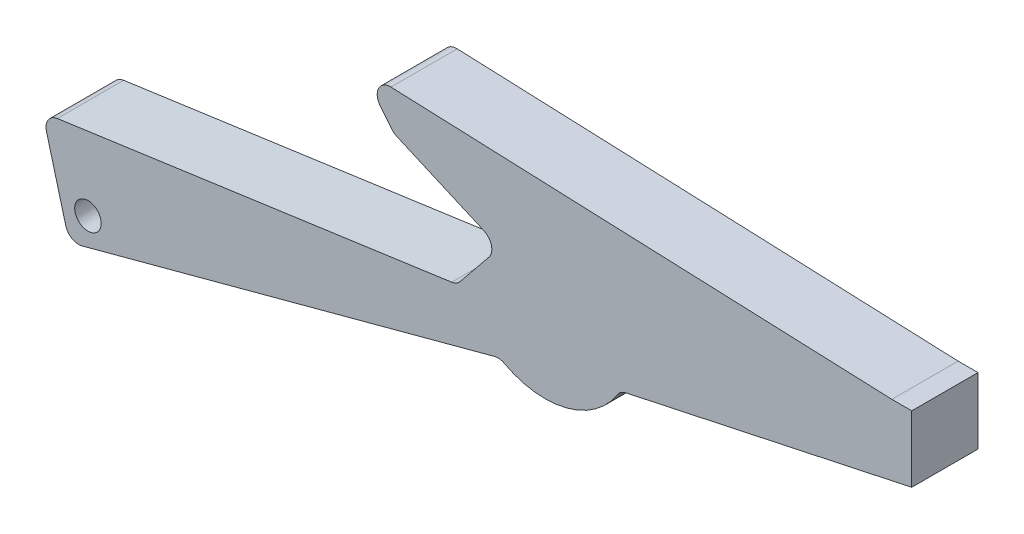
ISO-10303-21;
HEADER;
FILE_DESCRIPTION(('STEP AP214'),'2;1');
FILE_NAME('part.step','',(''),(''),'','','');
FILE_SCHEMA(('AUTOMOTIVE_DESIGN { 1 0 10303 214 1 1 1 1 }'));
ENDSEC;
DATA;
#1=APPLICATION_CONTEXT('core data for automotive mechanical design processes');
#2=APPLICATION_PROTOCOL_DEFINITION('international standard','automotive_design',2000,#1);
#3=PRODUCT_CONTEXT('',#1,'mechanical');
#4=PRODUCT('Part','Part','',(#3));
#5=PRODUCT_RELATED_PRODUCT_CATEGORY('part','',(#4));
#6=PRODUCT_DEFINITION_FORMATION('','',#4);
#7=PRODUCT_DEFINITION_CONTEXT('part definition',#1,'design');
#8=PRODUCT_DEFINITION('design','',#6,#7);
#9=PRODUCT_DEFINITION_SHAPE('','',#8);
#10=(LENGTH_UNIT() NAMED_UNIT(*) SI_UNIT(.MILLI.,.METRE.));
#11=(NAMED_UNIT(*) PLANE_ANGLE_UNIT() SI_UNIT($,.RADIAN.));
#12=(NAMED_UNIT(*) SI_UNIT($,.STERADIAN.) SOLID_ANGLE_UNIT());
#13=UNCERTAINTY_MEASURE_WITH_UNIT(LENGTH_MEASURE(1.E-05),#10,'distance_accuracy_value','');
#14=(GEOMETRIC_REPRESENTATION_CONTEXT(3) GLOBAL_UNCERTAINTY_ASSIGNED_CONTEXT((#13)) GLOBAL_UNIT_ASSIGNED_CONTEXT((#10,
#11,#12)) REPRESENTATION_CONTEXT('',''));
#15=CARTESIAN_POINT('',(0.,0.,0.));
#16=DIRECTION('',(0.,0.,1.));
#17=DIRECTION('',(1.,0.,0.));
#18=AXIS2_PLACEMENT_3D('',#15,#16,#17);
#19=CARTESIAN_POINT('',(8.56241817604146,-40.0432074228875,10.));
#20=DIRECTION('',(0.209102506116275,-0.977893727322092,0.));
#21=DIRECTION('',(0.977893727322092,0.209102506116275,0.));
#22=AXIS2_PLACEMENT_3D('',#19,#20,#21);
#23=PLANE('',#22);
#24=DIRECTION('',(-0.977893727322092,-0.209102506116275,0.));
#25=VECTOR('',#24,1.);
#26=CARTESIAN_POINT('',(8.56241817604146,-40.0432074228875,10.));
#27=LINE('',#26,#25);
#28=CARTESIAN_POINT('',(103.514798876067,-19.7395893390973,10.));
#29=VERTEX_POINT('',#28);
#30=CARTESIAN_POINT('',(60.3602712703458,-28.9672994884722,10.));
#31=VERTEX_POINT('',#30);
#32=EDGE_CURVE('E178',#29,#31,#27,.T.);
#33=ORIENTED_EDGE('',*,*,#32,.T.);
#34=DIRECTION('',(0.,0.,-1.));
#35=VECTOR('',#34,1.);
#36=CARTESIAN_POINT('',(60.3602712703458,-28.9672994884722,10.));
#37=LINE('',#36,#35);
#38=CARTESIAN_POINT('',(60.3602712703458,-28.9672994884722,0.));
#39=VERTEX_POINT('',#38);
#40=EDGE_CURVE('E184',#31,#39,#37,.T.);
#41=ORIENTED_EDGE('',*,*,#40,.T.);
#42=DIRECTION('',(-0.977893727322092,-0.209102506116275,0.));
#43=VECTOR('',#42,1.);
#44=CARTESIAN_POINT('',(8.56241817604146,-40.0432074228875,0.));
#45=LINE('',#44,#43);
#46=CARTESIAN_POINT('',(103.514798876067,-19.7395893390973,0.));
#47=VERTEX_POINT('',#46);
#48=EDGE_CURVE('E181',#47,#39,#45,.T.);
#49=ORIENTED_EDGE('',*,*,#48,.F.);
#50=DIRECTION('',(0.,0.,-1.));
#51=VECTOR('',#50,1.);
#52=CARTESIAN_POINT('',(103.514798876067,-19.7395893390973,10.));
#53=LINE('',#52,#51);
#54=EDGE_CURVE('E174',#29,#47,#53,.T.);
#55=ORIENTED_EDGE('',*,*,#54,.F.);
#56=EDGE_LOOP('',(#33,#41,#49,#55));
#57=FACE_BOUND('',#56,.T.);
#58=ADVANCED_FACE('F42',(#57),#23,.T.);
#59=CARTESIAN_POINT('',(103.514798876067,0.,10.));
#60=DIRECTION('',(-1.,0.,0.));
#61=DIRECTION('',(0.,0.,1.));
#62=AXIS2_PLACEMENT_3D('',#59,#60,#61);
#63=PLANE('',#62);
#64=DIRECTION('',(0.,1.,0.));
#65=VECTOR('',#64,1.);
#66=CARTESIAN_POINT('',(103.514798876067,0.,0.));
#67=LINE('',#66,#65);
#68=CARTESIAN_POINT('',(103.514798876067,-9.73958933909726,0.));
#69=VERTEX_POINT('',#68);
#70=EDGE_CURVE('E233',#47,#69,#67,.T.);
#71=ORIENTED_EDGE('',*,*,#70,.T.);
#72=DIRECTION('',(0.,0.,-1.));
#73=VECTOR('',#72,1.);
#74=CARTESIAN_POINT('',(103.514798876067,-9.73958933909726,10.));
#75=LINE('',#74,#73);
#76=CARTESIAN_POINT('',(103.514798876067,-9.73958933909726,10.));
#77=VERTEX_POINT('',#76);
#78=EDGE_CURVE('E185',#77,#69,#75,.T.);
#79=ORIENTED_EDGE('',*,*,#78,.F.);
#80=DIRECTION('',(0.,1.,0.));
#81=VECTOR('',#80,1.);
#82=CARTESIAN_POINT('',(103.514798876067,0.,10.));
#83=LINE('',#82,#81);
#84=EDGE_CURVE('E188',#29,#77,#83,.T.);
#85=ORIENTED_EDGE('',*,*,#84,.F.);
#86=ORIENTED_EDGE('',*,*,#54,.T.);
#87=EDGE_LOOP('',(#71,#79,#85,#86));
#88=FACE_BOUND('',#87,.T.);
#89=ADVANCED_FACE('F189',(#88),#63,.F.);
#90=CARTESIAN_POINT('',(0.,-9.73958933909726,10.));
#91=DIRECTION('',(0.,-1.,0.));
#92=DIRECTION('',(0.,0.,-1.));
#93=AXIS2_PLACEMENT_3D('',#90,#91,#92);
#94=PLANE('',#93);
#95=DIRECTION('',(-1.,0.,0.));
#96=VECTOR('',#95,1.);
#97=CARTESIAN_POINT('',(0.,-9.73958933909726,0.));
#98=LINE('',#97,#96);
#99=CARTESIAN_POINT('',(100.514798876067,-9.73958933909726,0.));
#100=VERTEX_POINT('',#99);
#101=EDGE_CURVE('E236',#69,#100,#98,.T.);
#102=ORIENTED_EDGE('',*,*,#101,.T.);
#103=DIRECTION('',(0.,0.,-1.));
#104=VECTOR('',#103,1.);
#105=CARTESIAN_POINT('',(100.514798876067,-9.73958933909726,10.));
#106=LINE('',#105,#104);
#107=CARTESIAN_POINT('',(100.514798876067,-9.73958933909726,10.));
#108=VERTEX_POINT('',#107);
#109=EDGE_CURVE('E231',#108,#100,#106,.T.);
#110=ORIENTED_EDGE('',*,*,#109,.F.);
#111=DIRECTION('',(-1.,0.,0.));
#112=VECTOR('',#111,1.);
#113=CARTESIAN_POINT('',(0.,-9.73958933909726,10.));
#114=LINE('',#113,#112);
#115=EDGE_CURVE('E193',#77,#108,#114,.T.);
#116=ORIENTED_EDGE('',*,*,#115,.F.);
#117=ORIENTED_EDGE('',*,*,#78,.T.);
#118=EDGE_LOOP('',(#102,#110,#116,#117));
#119=FACE_BOUND('',#118,.T.);
#120=ADVANCED_FACE('F380',(#119),#94,.F.);
#121=CARTESIAN_POINT('',(-0.22827300747503,-5.71712938643156,10.));
#122=DIRECTION('',(0.0398961171974141,0.99920383297532,0.));
#123=DIRECTION('',(-0.99920383297532,0.0398961171974141,0.));
#124=AXIS2_PLACEMENT_3D('',#121,#122,#123);
#125=PLANE('',#124);
#126=DIRECTION('',(0.99920383297532,-0.0398961171974141,0.));
#127=VECTOR('',#126,1.);
#128=CARTESIAN_POINT('',(-0.22827300747503,-5.71712938643156,0.));
#129=LINE('',#128,#127);
#130=CARTESIAN_POINT('',(24.9081016634015,-6.7207722035345,0.));
#131=VERTEX_POINT('',#130);
#132=EDGE_CURVE('E239',#131,#100,#129,.T.);
#133=ORIENTED_EDGE('',*,*,#132,.F.);
#134=DIRECTION('',(0.,0.,-1.));
#135=VECTOR('',#134,1.);
#136=CARTESIAN_POINT('',(24.9081016634015,-6.7207722035345,10.));
#137=LINE('',#136,#135);
#138=CARTESIAN_POINT('',(24.9081016634015,-6.7207722035345,10.));
#139=VERTEX_POINT('',#138);
#140=EDGE_CURVE('E306',#131,#139,#137,.F.);
#141=ORIENTED_EDGE('',*,*,#140,.T.);
#142=DIRECTION('',(0.99920383297532,-0.0398961171974141,0.));
#143=VECTOR('',#142,1.);
#144=CARTESIAN_POINT('',(-0.22827300747503,-5.71712938643156,10.));
#145=LINE('',#144,#143);
#146=EDGE_CURVE('E210',#139,#108,#145,.T.);
#147=ORIENTED_EDGE('',*,*,#146,.T.);
#148=ORIENTED_EDGE('',*,*,#109,.T.);
#149=EDGE_LOOP('',(#133,#141,#147,#148));
#150=FACE_BOUND('',#149,.T.);
#151=ADVANCED_FACE('F385',(#150),#125,.T.);
#152=CARTESIAN_POINT('',(9.26585284224266,7.448399080149,10.));
#153=DIRECTION('',(-0.779401131701308,-0.626525239637416,0.));
#154=DIRECTION('',(0.626525239637416,-0.779401131701308,0.));
#155=AXIS2_PLACEMENT_3D('',#152,#153,#154);
#156=PLANE('',#155);
#157=DIRECTION('',(-0.626525239637416,0.779401131701308,0.));
#158=VECTOR('',#157,1.);
#159=CARTESIAN_POINT('',(9.26585284224266,7.448399080149,0.));
#160=LINE('',#159,#158);
#161=CARTESIAN_POINT('',(25.0300767576539,-12.1623894128651,0.));
#162=VERTEX_POINT('',#161);
#163=CARTESIAN_POINT('',(23.2695071656041,-9.97223034875997,0.));
#164=VERTEX_POINT('',#163);
#165=EDGE_CURVE('E241',#162,#164,#160,.T.);
#166=ORIENTED_EDGE('',*,*,#165,.F.);
#167=DIRECTION('',(0.,0.,-1.));
#168=VECTOR('',#167,1.);
#169=CARTESIAN_POINT('',(25.0300767576539,-12.1623894128651,10.));
#170=LINE('',#169,#168);
#171=CARTESIAN_POINT('',(25.0300767576539,-12.1623894128651,10.));
#172=VERTEX_POINT('',#171);
#173=EDGE_CURVE('E297',#162,#172,#170,.F.);
#174=ORIENTED_EDGE('',*,*,#173,.T.);
#175=DIRECTION('',(-0.626525239637416,0.779401131701308,0.));
#176=VECTOR('',#175,1.);
#177=CARTESIAN_POINT('',(9.26585284224266,7.448399080149,10.));
#178=LINE('',#177,#176);
#179=CARTESIAN_POINT('',(23.2695071656041,-9.97223034875997,10.));
#180=VERTEX_POINT('',#179);
#181=EDGE_CURVE('E212',#172,#180,#178,.T.);
#182=ORIENTED_EDGE('',*,*,#181,.T.);
#183=DIRECTION('',(0.,0.,-1.));
#184=VECTOR('',#183,1.);
#185=CARTESIAN_POINT('',(23.2695071656041,-9.97223034875997,10.));
#186=LINE('',#185,#184);
#187=EDGE_CURVE('E294',#180,#164,#186,.T.);
#188=ORIENTED_EDGE('',*,*,#187,.T.);
#189=EDGE_LOOP('',(#166,#174,#182,#188));
#190=FACE_BOUND('',#189,.T.);
#191=ADVANCED_FACE('F388',(#190),#156,.T.);
#192=CARTESIAN_POINT('',(-0.541372474078678,-1.23917524538091,10.));
#193=DIRECTION('',(-0.400342898082665,-0.916365409623679,0.));
#194=DIRECTION('',(0.916365409623679,-0.400342898082665,0.));
#195=AXIS2_PLACEMENT_3D('',#192,#193,#194);
#196=PLANE('',#195);
#197=DIRECTION('',(-0.916365409623679,0.400342898082665,0.));
#198=VECTOR('',#197,1.);
#199=CARTESIAN_POINT('',(-0.541372474078678,-1.23917524538091,0.));
#200=LINE('',#199,#198);
#201=CARTESIAN_POINT('',(38.9310521874236,-18.4839388706525,0.));
#202=VERTEX_POINT('',#201);
#203=CARTESIAN_POINT('',(25.7881932248912,-12.7420697528376,0.));
#204=VERTEX_POINT('',#203);
#205=EDGE_CURVE('E244',#202,#204,#200,.T.);
#206=ORIENTED_EDGE('',*,*,#205,.F.);
#207=DIRECTION('',(0.,0.,-1.));
#208=VECTOR('',#207,1.);
#209=CARTESIAN_POINT('',(38.9310521874235,-18.4839388706525,10.));
#210=LINE('',#209,#208);
#211=CARTESIAN_POINT('',(38.9310521874236,-18.4839388706525,10.));
#212=VERTEX_POINT('',#211);
#213=EDGE_CURVE('E279',#202,#212,#210,.F.);
#214=ORIENTED_EDGE('',*,*,#213,.T.);
#215=DIRECTION('',(-0.916365409623679,0.400342898082665,0.));
#216=VECTOR('',#215,1.);
#217=CARTESIAN_POINT('',(-0.541372474078678,-1.23917524538091,10.));
#218=LINE('',#217,#216);
#219=CARTESIAN_POINT('',(25.7881932248912,-12.7420697528376,10.));
#220=VERTEX_POINT('',#219);
#221=EDGE_CURVE('E215',#212,#220,#218,.T.);
#222=ORIENTED_EDGE('',*,*,#221,.T.);
#223=DIRECTION('',(0.,0.,-1.));
#224=VECTOR('',#223,1.);
#225=CARTESIAN_POINT('',(25.7881932248912,-12.7420697528376,10.));
#226=LINE('',#225,#224);
#227=EDGE_CURVE('E276',#220,#204,#226,.T.);
#228=ORIENTED_EDGE('',*,*,#227,.T.);
#229=EDGE_LOOP('',(#206,#214,#222,#228));
#230=FACE_BOUND('',#229,.T.);
#231=ADVANCED_FACE('F392',(#230),#196,.T.);
#232=CARTESIAN_POINT('',(34.5051859559979,-27.9659022448351,10.));
#233=DIRECTION('',(-0.776879926305614,0.629648775194063,0.));
#234=DIRECTION('',(-0.629648775194063,-0.776879926305614,0.));
#235=AXIS2_PLACEMENT_3D('',#232,#233,#234);
#236=PLANE('',#235);
#237=DIRECTION('',(0.629648775194063,0.776879926305614,0.));
#238=VECTOR('',#237,1.);
#239=CARTESIAN_POINT('',(34.5051859559979,-27.9659022448351,10.));
#240=LINE('',#239,#238);
#241=CARTESIAN_POINT('',(35.3497977673189,-26.9237943466126,10.));
#242=VERTEX_POINT('',#241);
#243=CARTESIAN_POINT('',(39.6841262438694,-21.5759672402879,10.));
#244=VERTEX_POINT('',#243);
#245=EDGE_CURVE('E218',#242,#244,#240,.T.);
#246=ORIENTED_EDGE('',*,*,#245,.T.);
#247=DIRECTION('',(0.,0.,-1.));
#248=VECTOR('',#247,1.);
#249=CARTESIAN_POINT('',(39.6841262438694,-21.5759672402879,0.));
#250=LINE('',#249,#248);
#251=CARTESIAN_POINT('',(39.6841262438694,-21.5759672402879,0.));
#252=VERTEX_POINT('',#251);
#253=EDGE_CURVE('E273',#244,#252,#250,.T.);
#254=ORIENTED_EDGE('',*,*,#253,.T.);
#255=DIRECTION('',(0.629648775194063,0.776879926305614,0.));
#256=VECTOR('',#255,1.);
#257=CARTESIAN_POINT('',(34.5051859559979,-27.9659022448351,0.));
#258=LINE('',#257,#256);
#259=CARTESIAN_POINT('',(35.3497977673189,-26.9237943466126,0.));
#260=VERTEX_POINT('',#259);
#261=EDGE_CURVE('E247',#260,#252,#258,.T.);
#262=ORIENTED_EDGE('',*,*,#261,.F.);
#263=DIRECTION('',(0.,0.,-1.));
#264=VECTOR('',#263,1.);
#265=CARTESIAN_POINT('',(35.3497977673189,-26.9237943466126,10.));
#266=LINE('',#265,#264);
#267=EDGE_CURVE('E271',#260,#242,#266,.F.);
#268=ORIENTED_EDGE('',*,*,#267,.T.);
#269=EDGE_LOOP('',(#246,#254,#262,#268));
#270=FACE_BOUND('',#269,.T.);
#271=ADVANCED_FACE('F330',(#270),#236,.T.);
#272=CARTESIAN_POINT('',(4.46999381597289,-31.8056586574172,10.));
#273=DIRECTION('',(-0.13917310096007,0.99026806874157,0.));
#274=DIRECTION('',(-0.99026806874157,-0.13917310096007,0.));
#275=AXIS2_PLACEMENT_3D('',#272,#273,#274);
#276=PLANE('',#275);
#277=DIRECTION('',(0.99026806874157,0.13917310096007,0.));
#278=VECTOR('',#277,1.);
#279=CARTESIAN_POINT('',(4.46999381597289,-31.8056586574172,10.));
#280=LINE('',#279,#278);
#281=CARTESIAN_POINT('',(-25.4427221113232,-36.009616722055,10.));
#282=VERTEX_POINT('',#281);
#283=CARTESIAN_POINT('',(34.0743841166278,-27.6450329337076,10.));
#284=VERTEX_POINT('',#283);
#285=EDGE_CURVE('E221',#282,#284,#280,.T.);
#286=ORIENTED_EDGE('',*,*,#285,.T.);
#287=DIRECTION('',(0.,0.,-1.));
#288=VECTOR('',#287,1.);
#289=CARTESIAN_POINT('',(34.0743841166278,-27.6450329337076,0.));
#290=LINE('',#289,#288);
#291=CARTESIAN_POINT('',(34.0743841166278,-27.6450329337076,0.));
#292=VERTEX_POINT('',#291);
#293=EDGE_CURVE('E283',#284,#292,#290,.T.);
#294=ORIENTED_EDGE('',*,*,#293,.T.);
#295=DIRECTION('',(0.99026806874157,0.13917310096007,0.));
#296=VECTOR('',#295,1.);
#297=CARTESIAN_POINT('',(4.46999381597289,-31.8056586574172,0.));
#298=LINE('',#297,#296);
#299=CARTESIAN_POINT('',(-25.4427221113232,-36.009616722055,0.));
#300=VERTEX_POINT('',#299);
#301=EDGE_CURVE('E250',#300,#292,#298,.T.);
#302=ORIENTED_EDGE('',*,*,#301,.F.);
#303=DIRECTION('',(0.,0.,-1.));
#304=VECTOR('',#303,1.);
#305=CARTESIAN_POINT('',(-25.4427221113232,-36.009616722055,10.));
#306=LINE('',#305,#304);
#307=EDGE_CURVE('E281',#300,#282,#306,.F.);
#308=ORIENTED_EDGE('',*,*,#307,.T.);
#309=EDGE_LOOP('',(#286,#294,#302,#308));
#310=FACE_BOUND('',#309,.T.);
#311=ADVANCED_FACE('F336',(#310),#276,.T.);
#312=CARTESIAN_POINT('',(-34.9080722261263,-9.35358976231789,10.));
#313=DIRECTION('',(0.965925826289068,0.258819045102522,0.));
#314=DIRECTION('',(-0.258819045102522,0.965925826289068,0.));
#315=AXIS2_PLACEMENT_3D('',#312,#313,#314);
#316=PLANE('',#315);
#317=DIRECTION('',(0.258819045102522,-0.965925826289068,0.));
#318=VECTOR('',#317,1.);
#319=CARTESIAN_POINT('',(-34.9080722261263,-9.35358976231789,10.));
#320=LINE('',#319,#318);
#321=CARTESIAN_POINT('',(-27.0962275619812,-38.5077909497432,10.));
#322=VERTEX_POINT('',#321);
#323=CARTESIAN_POINT('',(-24.1797111932452,-49.3923782189723,10.));
#324=VERTEX_POINT('',#323);
#325=EDGE_CURVE('E224',#322,#324,#320,.T.);
#326=ORIENTED_EDGE('',*,*,#325,.F.);
#327=DIRECTION('',(0.,0.,-1.));
#328=VECTOR('',#327,1.);
#329=CARTESIAN_POINT('',(-27.0962275619812,-38.5077909497432,0.));
#330=LINE('',#329,#328);
#331=CARTESIAN_POINT('',(-27.0962275619812,-38.5077909497432,0.));
#332=VERTEX_POINT('',#331);
#333=EDGE_CURVE('E309',#322,#332,#330,.T.);
#334=ORIENTED_EDGE('',*,*,#333,.T.);
#335=DIRECTION('',(0.258819045102522,-0.965925826289068,0.));
#336=VECTOR('',#335,1.);
#337=CARTESIAN_POINT('',(-34.9080722261263,-9.35358976231789,0.));
#338=LINE('',#337,#336);
#339=CARTESIAN_POINT('',(-24.1797111932452,-49.3923782189723,0.));
#340=VERTEX_POINT('',#339);
#341=EDGE_CURVE('E253',#332,#340,#338,.T.);
#342=ORIENTED_EDGE('',*,*,#341,.T.);
#343=DIRECTION('',(0.,0.,-1.));
#344=VECTOR('',#343,1.);
#345=CARTESIAN_POINT('',(-24.1797111932452,-49.3923782189723,10.));
#346=LINE('',#345,#344);
#347=EDGE_CURVE('E57',#340,#324,#346,.F.);
#348=ORIENTED_EDGE('',*,*,#347,.T.);
#349=EDGE_LOOP('',(#326,#334,#342,#348));
#350=FACE_BOUND('',#349,.T.);
#351=ADVANCED_FACE('F342',(#350),#316,.F.);
#352=CARTESIAN_POINT('',(11.2459991230863,-41.9706401092324,10.));
#353=DIRECTION('',(-0.258819045102525,0.965925826289067,0.));
#354=DIRECTION('',(-0.965925826289067,-0.258819045102525,0.));
#355=AXIS2_PLACEMENT_3D('',#352,#353,#354);
#356=PLANE('',#355);
#357=DIRECTION('',(0.965925826289067,0.258819045102525,0.));
#358=VECTOR('',#357,1.);
#359=CARTESIAN_POINT('',(11.2459991230863,-41.9706401092324,0.));
#360=LINE('',#359,#358);
#361=CARTESIAN_POINT('',(-21.730221450462,-50.8065917813454,0.));
#362=VERTEX_POINT('',#361);
#363=CARTESIAN_POINT('',(40.5410413393639,-34.121057205145,0.));
#364=VERTEX_POINT('',#363);
#365=EDGE_CURVE('E203',#362,#364,#360,.T.);
#366=ORIENTED_EDGE('',*,*,#365,.T.);
#367=DIRECTION('',(0.,0.,1.));
#368=VECTOR('',#367,1.);
#369=CARTESIAN_POINT('',(40.5410413393639,-34.121057205145,10.));
#370=LINE('',#369,#368);
#371=CARTESIAN_POINT('',(40.5410413393639,-34.121057205145,10.));
#372=VERTEX_POINT('',#371);
#373=EDGE_CURVE('E269',#364,#372,#370,.T.);
#374=ORIENTED_EDGE('',*,*,#373,.T.);
#375=DIRECTION('',(0.965925826289067,0.258819045102525,0.));
#376=VECTOR('',#375,1.);
#377=CARTESIAN_POINT('',(11.2459991230863,-41.9706401092324,10.));
#378=LINE('',#377,#376);
#379=CARTESIAN_POINT('',(-21.730221450462,-50.8065917813454,10.));
#380=VERTEX_POINT('',#379);
#381=EDGE_CURVE('E226',#380,#372,#378,.T.);
#382=ORIENTED_EDGE('',*,*,#381,.F.);
#383=DIRECTION('',(0.,0.,-1.));
#384=VECTOR('',#383,1.);
#385=CARTESIAN_POINT('',(-21.730221450462,-50.8065917813454,10.));
#386=LINE('',#385,#384);
#387=EDGE_CURVE('E266',#380,#362,#386,.T.);
#388=ORIENTED_EDGE('',*,*,#387,.T.);
#389=EDGE_LOOP('',(#366,#374,#382,#388));
#390=FACE_BOUND('',#389,.T.);
#391=ADVANCED_FACE('F349',(#390),#356,.F.);
#392=CARTESIAN_POINT('',(48.1469236763019,-22.8333478401002,10.));
#393=DIRECTION('',(0.,0.,-1.));
#394=DIRECTION('',(-1.,0.,0.));
#395=AXIS2_PLACEMENT_3D('',#392,#393,#394);
#396=CYLINDRICAL_SURFACE('',#395,13.);
#397=CARTESIAN_POINT('',(48.1469236763019,-22.8333478401002,0.));
#398=DIRECTION('',(0.,0.,1.));
#399=DIRECTION('',(1.,0.,0.));
#400=AXIS2_PLACEMENT_3D('',#397,#398,#399);
#401=CIRCLE('',#400,13.);
#402=CARTESIAN_POINT('',(42.0037786624667,-34.2903007220401,0.));
#403=VERTEX_POINT('',#402);
#404=CARTESIAN_POINT('',(59.0942692684081,-29.8444550627143,0.));
#405=VERTEX_POINT('',#404);
#406=EDGE_CURVE('E200',#403,#405,#401,.T.);
#407=ORIENTED_EDGE('',*,*,#406,.T.);
#408=DIRECTION('',(0.,0.,-1.));
#409=VECTOR('',#408,1.);
#410=CARTESIAN_POINT('',(59.0942692684081,-29.8444550627143,10.));
#411=LINE('',#410,#409);
#412=CARTESIAN_POINT('',(59.0942692684081,-29.8444550627143,10.));
#413=VERTEX_POINT('',#412);
#414=EDGE_CURVE('E264',#405,#413,#411,.F.);
#415=ORIENTED_EDGE('',*,*,#414,.T.);
#416=CARTESIAN_POINT('',(48.1469236763019,-22.8333478401002,10.));
#417=DIRECTION('',(0.,0.,1.));
#418=DIRECTION('',(1.,0.,0.));
#419=AXIS2_PLACEMENT_3D('',#416,#417,#418);
#420=CIRCLE('',#419,13.);
#421=CARTESIAN_POINT('',(42.0037786624667,-34.2903007220401,10.));
#422=VERTEX_POINT('',#421);
#423=EDGE_CURVE('E229',#422,#413,#420,.T.);
#424=ORIENTED_EDGE('',*,*,#423,.F.);
#425=DIRECTION('',(0.,0.,-1.));
#426=VECTOR('',#425,1.);
#427=CARTESIAN_POINT('',(42.0037786624667,-34.2903007220401,10.));
#428=LINE('',#427,#426);
#429=EDGE_CURVE('E261',#422,#403,#428,.T.);
#430=ORIENTED_EDGE('',*,*,#429,.T.);
#431=EDGE_LOOP('',(#407,#415,#424,#430));
#432=FACE_BOUND('',#431,.T.);
#433=ADVANCED_FACE('F358',(#432),#396,.T.);
#434=CARTESIAN_POINT('',(0.,0.,10.));
#435=DIRECTION('',(0.,0.,1.));
#436=DIRECTION('',(1.,0.,0.));
#437=AXIS2_PLACEMENT_3D('',#434,#435,#436);
#438=PLANE('',#437);
#439=CARTESIAN_POINT('',(-20.833645978294,-46.4252503859841,10.));
#440=DIRECTION('',(0.,0.,1.));
#441=DIRECTION('',(1.,0.,0.));
#442=AXIS2_PLACEMENT_3D('',#439,#440,#441);
#443=CIRCLE('',#442,2.);
#444=CARTESIAN_POINT('',(-18.833645978294,-46.4252503859841,10.));
#445=VERTEX_POINT('',#444);
#446=EDGE_CURVE('E206',#445,#445,#443,.T.);
#447=ORIENTED_EDGE('',*,*,#446,.F.);
#448=EDGE_LOOP('',(#447));
#449=FACE_BOUND('',#448,.T.);
#450=ORIENTED_EDGE('',*,*,#181,.F.);
#451=CARTESIAN_POINT('',(26.5888790210565,-10.9093389335903,10.));
#452=DIRECTION('',(0.,0.,1.));
#453=DIRECTION('',(1.,0.,0.));
#454=AXIS2_PLACEMENT_3D('',#451,#452,#453);
#455=CIRCLE('',#454,2.);
#456=EDGE_CURVE('E304',#172,#220,#455,.T.);
#457=ORIENTED_EDGE('',*,*,#456,.T.);
#458=ORIENTED_EDGE('',*,*,#221,.F.);
#459=CARTESIAN_POINT('',(38.1303663912582,-20.3166696898998,10.));
#460=DIRECTION('',(0.,0.,1.));
#461=DIRECTION('',(1.,0.,0.));
#462=AXIS2_PLACEMENT_3D('',#459,#460,#461);
#463=CIRCLE('',#462,2.);
#464=EDGE_CURVE('E321',#212,#244,#463,.F.);
#465=ORIENTED_EDGE('',*,*,#464,.T.);
#466=ORIENTED_EDGE('',*,*,#245,.F.);
#467=CARTESIAN_POINT('',(33.7960379147076,-25.6644967962245,10.));
#468=DIRECTION('',(0.,0.,1.));
#469=DIRECTION('',(1.,0.,0.));
#470=AXIS2_PLACEMENT_3D('',#467,#468,#469);
#471=CIRCLE('',#470,2.);
#472=EDGE_CURVE('E11',#242,#284,#471,.F.);
#473=ORIENTED_EDGE('',*,*,#472,.T.);
#474=ORIENTED_EDGE('',*,*,#285,.F.);
#475=CARTESIAN_POINT('',(-25.1643759094031,-37.9901528595382,10.));
#476=DIRECTION('',(0.,0.,1.));
#477=DIRECTION('',(1.,0.,0.));
#478=AXIS2_PLACEMENT_3D('',#475,#476,#477);
#479=CIRCLE('',#478,2.);
#480=EDGE_CURVE('E64',#282,#322,#479,.T.);
#481=ORIENTED_EDGE('',*,*,#480,.T.);
#482=ORIENTED_EDGE('',*,*,#325,.T.);
#483=CARTESIAN_POINT('',(-22.2478595406671,-48.8747401287673,10.));
#484=DIRECTION('',(0.,0.,1.));
#485=DIRECTION('',(1.,0.,0.));
#486=AXIS2_PLACEMENT_3D('',#483,#484,#485);
#487=CIRCLE('',#486,2.);
#488=EDGE_CURVE('E299',#324,#380,#487,.T.);
#489=ORIENTED_EDGE('',*,*,#488,.T.);
#490=ORIENTED_EDGE('',*,*,#381,.T.);
#491=CARTESIAN_POINT('',(41.058679429569,-36.0529088577232,10.));
#492=DIRECTION('',(0.,0.,1.));
#493=DIRECTION('',(1.,0.,0.));
#494=AXIS2_PLACEMENT_3D('',#491,#492,#493);
#495=CIRCLE('',#494,2.);
#496=EDGE_CURVE('E317',#372,#422,#495,.F.);
#497=ORIENTED_EDGE('',*,*,#496,.T.);
#498=ORIENTED_EDGE('',*,*,#423,.T.);
#499=CARTESIAN_POINT('',(60.7784762825783,-30.9230869431164,10.));
#500=DIRECTION('',(0.,0.,1.));
#501=DIRECTION('',(1.,0.,0.));
#502=AXIS2_PLACEMENT_3D('',#499,#500,#501);
#503=CIRCLE('',#502,2.);
#504=EDGE_CURVE('E199',#413,#31,#503,.F.);
#505=ORIENTED_EDGE('',*,*,#504,.T.);
#506=ORIENTED_EDGE('',*,*,#32,.F.);
#507=ORIENTED_EDGE('',*,*,#84,.T.);
#508=ORIENTED_EDGE('',*,*,#115,.T.);
#509=ORIENTED_EDGE('',*,*,#146,.F.);
#510=CARTESIAN_POINT('',(24.8283094290067,-8.71917986948514,10.));
#511=DIRECTION('',(0.,0.,1.));
#512=DIRECTION('',(1.,0.,0.));
#513=AXIS2_PLACEMENT_3D('',#510,#511,#512);
#514=CIRCLE('',#513,2.);
#515=EDGE_CURVE('E302',#139,#180,#514,.T.);
#516=ORIENTED_EDGE('',*,*,#515,.T.);
#517=EDGE_LOOP('',(#450,#457,#458,#465,#466,#473,#474,#481,#482,#489,#490,#497,#498,#505,#506,
#507,#508,#509,#516));
#518=FACE_BOUND('',#517,.T.);
#519=ADVANCED_FACE('F196',(#449,#518),#438,.T.);
#520=CARTESIAN_POINT('',(0.,0.,0.));
#521=DIRECTION('',(0.,0.,1.));
#522=DIRECTION('',(1.,0.,0.));
#523=AXIS2_PLACEMENT_3D('',#520,#521,#522);
#524=PLANE('',#523);
#525=CARTESIAN_POINT('',(-20.833645978294,-46.4252503859841,0.));
#526=DIRECTION('',(0.,0.,1.));
#527=DIRECTION('',(1.,0.,0.));
#528=AXIS2_PLACEMENT_3D('',#525,#526,#527);
#529=CIRCLE('',#528,2.);
#530=CARTESIAN_POINT('',(-18.833645978294,-46.4252503859841,0.));
#531=VERTEX_POINT('',#530);
#532=EDGE_CURVE('E234',#531,#531,#529,.T.);
#533=ORIENTED_EDGE('',*,*,#532,.T.);
#534=EDGE_LOOP('',(#533));
#535=FACE_BOUND('',#534,.T.);
#536=ORIENTED_EDGE('',*,*,#205,.T.);
#537=CARTESIAN_POINT('',(26.5888790210565,-10.9093389335903,0.));
#538=DIRECTION('',(0.,0.,1.));
#539=DIRECTION('',(1.,0.,0.));
#540=AXIS2_PLACEMENT_3D('',#537,#538,#539);
#541=CIRCLE('',#540,2.);
#542=EDGE_CURVE('E292',#204,#162,#541,.F.);
#543=ORIENTED_EDGE('',*,*,#542,.T.);
#544=ORIENTED_EDGE('',*,*,#165,.T.);
#545=CARTESIAN_POINT('',(24.8283094290067,-8.71917986948514,0.));
#546=DIRECTION('',(0.,0.,1.));
#547=DIRECTION('',(1.,0.,0.));
#548=AXIS2_PLACEMENT_3D('',#545,#546,#547);
#549=CIRCLE('',#548,2.);
#550=EDGE_CURVE('E290',#164,#131,#549,.F.);
#551=ORIENTED_EDGE('',*,*,#550,.T.);
#552=ORIENTED_EDGE('',*,*,#132,.T.);
#553=ORIENTED_EDGE('',*,*,#101,.F.);
#554=ORIENTED_EDGE('',*,*,#70,.F.);
#555=ORIENTED_EDGE('',*,*,#48,.T.);
#556=CARTESIAN_POINT('',(60.7784762825783,-30.9230869431164,0.));
#557=DIRECTION('',(0.,0.,1.));
#558=DIRECTION('',(1.,0.,0.));
#559=AXIS2_PLACEMENT_3D('',#556,#557,#558);
#560=CIRCLE('',#559,2.);
#561=EDGE_CURVE('E312',#39,#405,#560,.T.);
#562=ORIENTED_EDGE('',*,*,#561,.T.);
#563=ORIENTED_EDGE('',*,*,#406,.F.);
#564=CARTESIAN_POINT('',(41.058679429569,-36.0529088577232,0.));
#565=DIRECTION('',(0.,0.,1.));
#566=DIRECTION('',(1.,0.,0.));
#567=AXIS2_PLACEMENT_3D('',#564,#565,#566);
#568=CIRCLE('',#567,2.);
#569=EDGE_CURVE('E315',#403,#364,#568,.T.);
#570=ORIENTED_EDGE('',*,*,#569,.T.);
#571=ORIENTED_EDGE('',*,*,#365,.F.);
#572=CARTESIAN_POINT('',(-22.2478595406671,-48.8747401287673,0.));
#573=DIRECTION('',(0.,0.,1.));
#574=DIRECTION('',(1.,0.,0.));
#575=AXIS2_PLACEMENT_3D('',#572,#573,#574);
#576=CIRCLE('',#575,2.);
#577=EDGE_CURVE('E286',#362,#340,#576,.F.);
#578=ORIENTED_EDGE('',*,*,#577,.T.);
#579=ORIENTED_EDGE('',*,*,#341,.F.);
#580=CARTESIAN_POINT('',(-25.1643759094031,-37.9901528595382,0.));
#581=DIRECTION('',(0.,0.,1.));
#582=DIRECTION('',(1.,0.,0.));
#583=AXIS2_PLACEMENT_3D('',#580,#581,#582);
#584=CIRCLE('',#583,2.);
#585=EDGE_CURVE('E288',#332,#300,#584,.F.);
#586=ORIENTED_EDGE('',*,*,#585,.T.);
#587=ORIENTED_EDGE('',*,*,#301,.T.);
#588=CARTESIAN_POINT('',(33.7960379147076,-25.6644967962245,0.));
#589=DIRECTION('',(0.,0.,1.));
#590=DIRECTION('',(1.,0.,0.));
#591=AXIS2_PLACEMENT_3D('',#588,#589,#590);
#592=CIRCLE('',#591,2.);
#593=EDGE_CURVE('E50',#292,#260,#592,.T.);
#594=ORIENTED_EDGE('',*,*,#593,.T.);
#595=ORIENTED_EDGE('',*,*,#261,.T.);
#596=CARTESIAN_POINT('',(38.1303663912582,-20.3166696898998,0.));
#597=DIRECTION('',(0.,0.,1.));
#598=DIRECTION('',(1.,0.,0.));
#599=AXIS2_PLACEMENT_3D('',#596,#597,#598);
#600=CIRCLE('',#599,2.);
#601=EDGE_CURVE('E319',#252,#202,#600,.T.);
#602=ORIENTED_EDGE('',*,*,#601,.T.);
#603=EDGE_LOOP('',(#536,#543,#544,#551,#552,#553,#554,#555,#562,#563,#570,#571,#578,#579,#586,
#587,#594,#595,#602));
#604=FACE_BOUND('',#603,.T.);
#605=ADVANCED_FACE('F324',(#535,#604),#524,.F.);
#606=CARTESIAN_POINT('',(-20.833645978294,-46.4252503859841,0.));
#607=DIRECTION('',(0.,0.,1.));
#608=DIRECTION('',(1.,0.,0.));
#609=AXIS2_PLACEMENT_3D('',#606,#607,#608);
#610=CYLINDRICAL_SURFACE('',#609,2.);
#611=ORIENTED_EDGE('',*,*,#532,.F.);
#612=EDGE_LOOP('',(#611));
#613=FACE_BOUND('',#612,.T.);
#614=ORIENTED_EDGE('',*,*,#446,.T.);
#615=EDGE_LOOP('',(#614));
#616=FACE_BOUND('',#615,.T.);
#617=ADVANCED_FACE('F363',(#613,#616),#610,.F.);
#618=CARTESIAN_POINT('',(60.7784762825783,-30.9230869431164,10.));
#619=DIRECTION('',(0.,0.,-1.));
#620=DIRECTION('',(-1.,0.,0.));
#621=AXIS2_PLACEMENT_3D('',#618,#619,#620);
#622=CYLINDRICAL_SURFACE('',#621,2.);
#623=ORIENTED_EDGE('',*,*,#504,.F.);
#624=ORIENTED_EDGE('',*,*,#414,.F.);
#625=ORIENTED_EDGE('',*,*,#561,.F.);
#626=ORIENTED_EDGE('',*,*,#40,.F.);
#627=EDGE_LOOP('',(#623,#624,#625,#626));
#628=FACE_BOUND('',#627,.T.);
#629=ADVANCED_FACE('F361',(#628),#622,.F.);
#630=CARTESIAN_POINT('',(41.058679429569,-36.0529088577232,10.));
#631=DIRECTION('',(0.,0.,-1.));
#632=DIRECTION('',(-1.,0.,0.));
#633=AXIS2_PLACEMENT_3D('',#630,#631,#632);
#634=CYLINDRICAL_SURFACE('',#633,2.);
#635=ORIENTED_EDGE('',*,*,#496,.F.);
#636=ORIENTED_EDGE('',*,*,#373,.F.);
#637=ORIENTED_EDGE('',*,*,#569,.F.);
#638=ORIENTED_EDGE('',*,*,#429,.F.);
#639=EDGE_LOOP('',(#635,#636,#637,#638));
#640=FACE_BOUND('',#639,.T.);
#641=ADVANCED_FACE('F355',(#640),#634,.F.);
#642=CARTESIAN_POINT('',(38.1303663912582,-20.3166696898998,10.));
#643=DIRECTION('',(0.,0.,1.));
#644=DIRECTION('',(1.,0.,0.));
#645=AXIS2_PLACEMENT_3D('',#642,#643,#644);
#646=CYLINDRICAL_SURFACE('',#645,2.);
#647=ORIENTED_EDGE('',*,*,#464,.F.);
#648=ORIENTED_EDGE('',*,*,#213,.F.);
#649=ORIENTED_EDGE('',*,*,#601,.F.);
#650=ORIENTED_EDGE('',*,*,#253,.F.);
#651=EDGE_LOOP('',(#647,#648,#649,#650));
#652=FACE_BOUND('',#651,.T.);
#653=ADVANCED_FACE('F369',(#652),#646,.F.);
#654=CARTESIAN_POINT('',(33.7960379147076,-25.6644967962245,10.));
#655=DIRECTION('',(0.,0.,1.));
#656=DIRECTION('',(1.,0.,0.));
#657=AXIS2_PLACEMENT_3D('',#654,#655,#656);
#658=CYLINDRICAL_SURFACE('',#657,2.);
#659=ORIENTED_EDGE('',*,*,#472,.F.);
#660=ORIENTED_EDGE('',*,*,#267,.F.);
#661=ORIENTED_EDGE('',*,*,#593,.F.);
#662=ORIENTED_EDGE('',*,*,#293,.F.);
#663=EDGE_LOOP('',(#659,#660,#661,#662));
#664=FACE_BOUND('',#663,.T.);
#665=ADVANCED_FACE('F334',(#664),#658,.F.);
#666=CARTESIAN_POINT('',(26.5888790210565,-10.9093389335903,10.));
#667=DIRECTION('',(0.,0.,-1.));
#668=DIRECTION('',(-1.,0.,0.));
#669=AXIS2_PLACEMENT_3D('',#666,#667,#668);
#670=CYLINDRICAL_SURFACE('',#669,2.);
#671=ORIENTED_EDGE('',*,*,#456,.F.);
#672=ORIENTED_EDGE('',*,*,#173,.F.);
#673=ORIENTED_EDGE('',*,*,#542,.F.);
#674=ORIENTED_EDGE('',*,*,#227,.F.);
#675=EDGE_LOOP('',(#671,#672,#673,#674));
#676=FACE_BOUND('',#675,.T.);
#677=ADVANCED_FACE('F460',(#676),#670,.T.);
#678=CARTESIAN_POINT('',(24.8283094290067,-8.71917986948514,10.));
#679=DIRECTION('',(0.,0.,-1.));
#680=DIRECTION('',(-1.,0.,0.));
#681=AXIS2_PLACEMENT_3D('',#678,#679,#680);
#682=CYLINDRICAL_SURFACE('',#681,2.);
#683=ORIENTED_EDGE('',*,*,#515,.F.);
#684=ORIENTED_EDGE('',*,*,#140,.F.);
#685=ORIENTED_EDGE('',*,*,#550,.F.);
#686=ORIENTED_EDGE('',*,*,#187,.F.);
#687=EDGE_LOOP('',(#683,#684,#685,#686));
#688=FACE_BOUND('',#687,.T.);
#689=ADVANCED_FACE('F469',(#688),#682,.T.);
#690=CARTESIAN_POINT('',(-25.1643759094031,-37.9901528595382,10.));
#691=DIRECTION('',(0.,0.,1.));
#692=DIRECTION('',(1.,0.,0.));
#693=AXIS2_PLACEMENT_3D('',#690,#691,#692);
#694=CYLINDRICAL_SURFACE('',#693,2.);
#695=ORIENTED_EDGE('',*,*,#480,.F.);
#696=ORIENTED_EDGE('',*,*,#307,.F.);
#697=ORIENTED_EDGE('',*,*,#585,.F.);
#698=ORIENTED_EDGE('',*,*,#333,.F.);
#699=EDGE_LOOP('',(#695,#696,#697,#698));
#700=FACE_BOUND('',#699,.T.);
#701=ADVANCED_FACE('F339',(#700),#694,.T.);
#702=CARTESIAN_POINT('',(-22.2478595406671,-48.8747401287673,10.));
#703=DIRECTION('',(0.,0.,-1.));
#704=DIRECTION('',(-1.,0.,0.));
#705=AXIS2_PLACEMENT_3D('',#702,#703,#704);
#706=CYLINDRICAL_SURFACE('',#705,2.);
#707=ORIENTED_EDGE('',*,*,#488,.F.);
#708=ORIENTED_EDGE('',*,*,#347,.F.);
#709=ORIENTED_EDGE('',*,*,#577,.F.);
#710=ORIENTED_EDGE('',*,*,#387,.F.);
#711=EDGE_LOOP('',(#707,#708,#709,#710));
#712=FACE_BOUND('',#711,.T.);
#713=ADVANCED_FACE('F44',(#712),#706,.T.);
#714=CLOSED_SHELL('',(#58,#89,#120,#151,#191,#231,#271,#311,#351,#391,#433,#519,#605,#617,#629,
#641,#653,#665,#677,#689,#701,#713));
#715=MANIFOLD_SOLID_BREP('B2',#714);
#716=ADVANCED_BREP_SHAPE_REPRESENTATION('',(#18,#715),#14);
#717=SHAPE_DEFINITION_REPRESENTATION(#9,#716);
ENDSEC;
END-ISO-10303-21;
